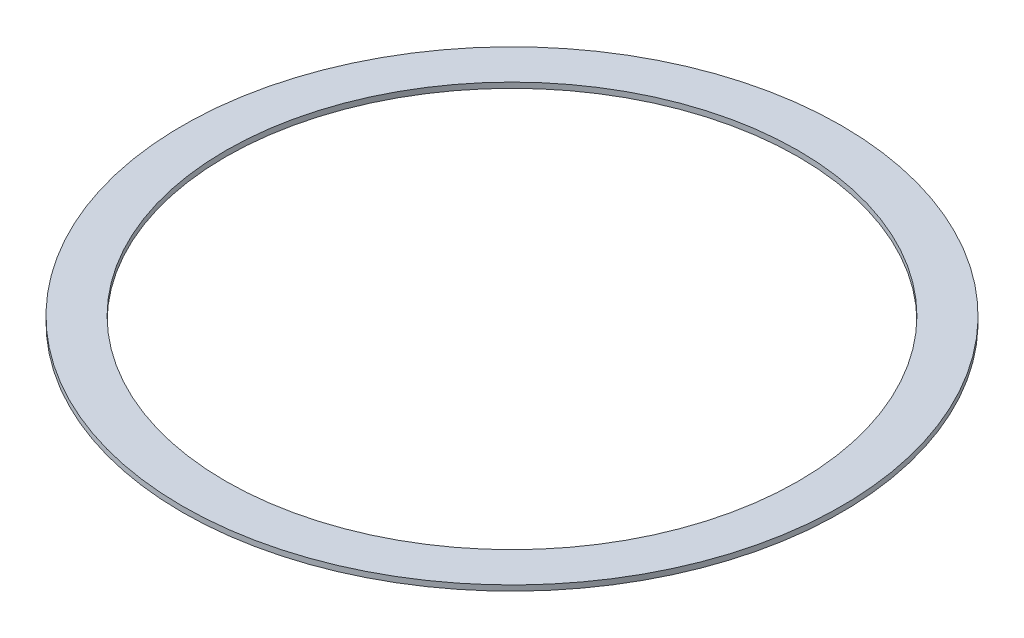
ISO-10303-21;
HEADER;
FILE_DESCRIPTION(('STEP AP214'),'2;1');
FILE_NAME('part.step','',(''),(''),'','','');
FILE_SCHEMA(('AUTOMOTIVE_DESIGN { 1 0 10303 214 1 1 1 1 }'));
ENDSEC;
DATA;
#1=APPLICATION_CONTEXT('core data for automotive mechanical design processes');
#2=APPLICATION_PROTOCOL_DEFINITION('international standard','automotive_design',2000,#1);
#3=PRODUCT_CONTEXT('',#1,'mechanical');
#4=PRODUCT('Part','Part','',(#3));
#5=PRODUCT_RELATED_PRODUCT_CATEGORY('part','',(#4));
#6=PRODUCT_DEFINITION_FORMATION('','',#4);
#7=PRODUCT_DEFINITION_CONTEXT('part definition',#1,'design');
#8=PRODUCT_DEFINITION('design','',#6,#7);
#9=PRODUCT_DEFINITION_SHAPE('','',#8);
#10=(LENGTH_UNIT() NAMED_UNIT(*) SI_UNIT(.MILLI.,.METRE.));
#11=(NAMED_UNIT(*) PLANE_ANGLE_UNIT() SI_UNIT($,.RADIAN.));
#12=(NAMED_UNIT(*) SI_UNIT($,.STERADIAN.) SOLID_ANGLE_UNIT());
#13=UNCERTAINTY_MEASURE_WITH_UNIT(LENGTH_MEASURE(1.E-05),#10,'distance_accuracy_value','');
#14=(GEOMETRIC_REPRESENTATION_CONTEXT(3) GLOBAL_UNCERTAINTY_ASSIGNED_CONTEXT((#13)) GLOBAL_UNIT_ASSIGNED_CONTEXT((#10,
#11,#12)) REPRESENTATION_CONTEXT('',''));
#15=CARTESIAN_POINT('',(0.,0.,0.));
#16=DIRECTION('',(0.,0.,1.));
#17=DIRECTION('',(1.,0.,0.));
#18=AXIS2_PLACEMENT_3D('',#15,#16,#17);
#19=CARTESIAN_POINT('',(0.,0.5,0.));
#20=DIRECTION('',(0.,1.,0.));
#21=DIRECTION('',(0.,0.,1.));
#22=AXIS2_PLACEMENT_3D('',#19,#20,#21);
#23=PLANE('',#22);
#24=CARTESIAN_POINT('',(0.,0.5,0.));
#25=DIRECTION('',(0.,1.,0.));
#26=DIRECTION('',(0.,0.,1.));
#27=AXIS2_PLACEMENT_3D('',#24,#25,#26);
#28=CIRCLE('',#27,30.5);
#29=CARTESIAN_POINT('',(0.,0.5,30.5));
#30=VERTEX_POINT('',#29);
#31=EDGE_CURVE('E10',#30,#30,#28,.T.);
#32=ORIENTED_EDGE('',*,*,#31,.T.);
#33=EDGE_LOOP('',(#32));
#34=FACE_BOUND('',#33,.T.);
#35=CARTESIAN_POINT('',(0.,0.5,0.));
#36=DIRECTION('',(0.,1.,0.));
#37=DIRECTION('',(0.,0.,1.));
#38=AXIS2_PLACEMENT_3D('',#35,#36,#37);
#39=CIRCLE('',#38,26.5);
#40=CARTESIAN_POINT('',(0.,0.5,26.5));
#41=VERTEX_POINT('',#40);
#42=EDGE_CURVE('E56',#41,#41,#39,.T.);
#43=ORIENTED_EDGE('',*,*,#42,.F.);
#44=EDGE_LOOP('',(#43));
#45=FACE_BOUND('',#44,.T.);
#46=ADVANCED_FACE('F43',(#34,#45),#23,.T.);
#47=CARTESIAN_POINT('',(0.,0.,0.));
#48=DIRECTION('',(0.,1.,0.));
#49=DIRECTION('',(0.,0.,1.));
#50=AXIS2_PLACEMENT_3D('',#47,#48,#49);
#51=PLANE('',#50);
#52=CARTESIAN_POINT('',(0.,0.,0.));
#53=DIRECTION('',(0.,1.,0.));
#54=DIRECTION('',(0.,0.,1.));
#55=AXIS2_PLACEMENT_3D('',#52,#53,#54);
#56=CIRCLE('',#55,30.5);
#57=CARTESIAN_POINT('',(0.,0.,30.5));
#58=VERTEX_POINT('',#57);
#59=EDGE_CURVE('E47',#58,#58,#56,.T.);
#60=ORIENTED_EDGE('',*,*,#59,.F.);
#61=EDGE_LOOP('',(#60));
#62=FACE_BOUND('',#61,.T.);
#63=CARTESIAN_POINT('',(0.,0.,0.));
#64=DIRECTION('',(0.,1.,0.));
#65=DIRECTION('',(0.,0.,1.));
#66=AXIS2_PLACEMENT_3D('',#63,#64,#65);
#67=CIRCLE('',#66,26.5);
#68=CARTESIAN_POINT('',(0.,0.,26.5));
#69=VERTEX_POINT('',#68);
#70=EDGE_CURVE('E58',#69,#69,#67,.T.);
#71=ORIENTED_EDGE('',*,*,#70,.T.);
#72=EDGE_LOOP('',(#71));
#73=FACE_BOUND('',#72,.T.);
#74=ADVANCED_FACE('F70',(#62,#73),#51,.F.);
#75=CARTESIAN_POINT('',(0.,0.5,0.));
#76=DIRECTION('',(0.,-1.,0.));
#77=DIRECTION('',(0.,0.,-1.));
#78=AXIS2_PLACEMENT_3D('',#75,#76,#77);
#79=CYLINDRICAL_SURFACE('',#78,30.5);
#80=ORIENTED_EDGE('',*,*,#31,.F.);
#81=EDGE_LOOP('',(#80));
#82=FACE_BOUND('',#81,.T.);
#83=ORIENTED_EDGE('',*,*,#59,.T.);
#84=EDGE_LOOP('',(#83));
#85=FACE_BOUND('',#84,.T.);
#86=ADVANCED_FACE('F45',(#82,#85),#79,.T.);
#87=CARTESIAN_POINT('',(0.,0.5,0.));
#88=DIRECTION('',(0.,-1.,0.));
#89=DIRECTION('',(0.,0.,-1.));
#90=AXIS2_PLACEMENT_3D('',#87,#88,#89);
#91=CYLINDRICAL_SURFACE('',#90,26.5);
#92=ORIENTED_EDGE('',*,*,#42,.T.);
#93=EDGE_LOOP('',(#92));
#94=FACE_BOUND('',#93,.T.);
#95=ORIENTED_EDGE('',*,*,#70,.F.);
#96=EDGE_LOOP('',(#95));
#97=FACE_BOUND('',#96,.T.);
#98=ADVANCED_FACE('F66',(#94,#97),#91,.F.);
#99=CLOSED_SHELL('',(#46,#74,#86,#98));
#100=MANIFOLD_SOLID_BREP('B2',#99);
#101=ADVANCED_BREP_SHAPE_REPRESENTATION('',(#18,#100),#14);
#102=SHAPE_DEFINITION_REPRESENTATION(#9,#101);
ENDSEC;
END-ISO-10303-21;
